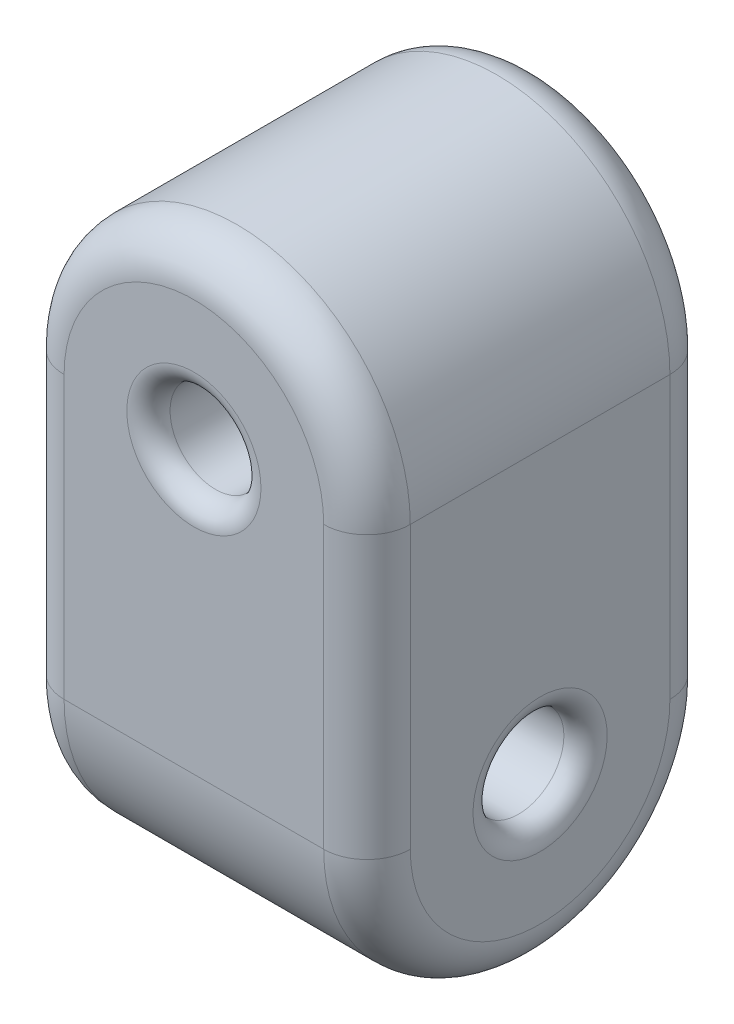
ISO-10303-21;
HEADER;
FILE_DESCRIPTION(('STEP AP214'),'2;1');
FILE_NAME('part.step','',(''),(''),'','','');
FILE_SCHEMA(('AUTOMOTIVE_DESIGN { 1 0 10303 214 1 1 1 1 }'));
ENDSEC;
DATA;
#1=APPLICATION_CONTEXT('core data for automotive mechanical design processes');
#2=APPLICATION_PROTOCOL_DEFINITION('international standard','automotive_design',2000,#1);
#3=PRODUCT_CONTEXT('',#1,'mechanical');
#4=PRODUCT('Part','Part','',(#3));
#5=PRODUCT_RELATED_PRODUCT_CATEGORY('part','',(#4));
#6=PRODUCT_DEFINITION_FORMATION('','',#4);
#7=PRODUCT_DEFINITION_CONTEXT('part definition',#1,'design');
#8=PRODUCT_DEFINITION('design','',#6,#7);
#9=PRODUCT_DEFINITION_SHAPE('','',#8);
#10=(LENGTH_UNIT() NAMED_UNIT(*) SI_UNIT(.MILLI.,.METRE.));
#11=(NAMED_UNIT(*) PLANE_ANGLE_UNIT() SI_UNIT($,.RADIAN.));
#12=(NAMED_UNIT(*) SI_UNIT($,.STERADIAN.) SOLID_ANGLE_UNIT());
#13=UNCERTAINTY_MEASURE_WITH_UNIT(LENGTH_MEASURE(1.E-05),#10,'distance_accuracy_value','');
#14=(GEOMETRIC_REPRESENTATION_CONTEXT(3) GLOBAL_UNCERTAINTY_ASSIGNED_CONTEXT((#13)) GLOBAL_UNIT_ASSIGNED_CONTEXT((#10,
#11,#12)) REPRESENTATION_CONTEXT('',''));
#15=CARTESIAN_POINT('',(0.,0.,0.));
#16=DIRECTION('',(0.,0.,1.));
#17=DIRECTION('',(1.,0.,0.));
#18=AXIS2_PLACEMENT_3D('',#15,#16,#17);
#19=CARTESIAN_POINT('',(0.,0.,8.8));
#20=DIRECTION('',(0.,0.,-1.));
#21=DIRECTION('',(-1.,0.,0.));
#22=AXIS2_PLACEMENT_3D('',#19,#20,#21);
#23=CYLINDRICAL_SURFACE('',#22,4.);
#24=DIRECTION('',(0.,0.,-1.));
#25=VECTOR('',#24,1.);
#26=CARTESIAN_POINT('',(-4.,0.,8.8));
#27=LINE('',#26,#25);
#28=CARTESIAN_POINT('',(-4.,0.,7.8));
#29=VERTEX_POINT('',#28);
#30=CARTESIAN_POINT('',(-4.,0.,1.8));
#31=VERTEX_POINT('',#30);
#32=EDGE_CURVE('E146',#29,#31,#27,.T.);
#33=ORIENTED_EDGE('',*,*,#32,.F.);
#34=CARTESIAN_POINT('',(0.,0.,7.8));
#35=DIRECTION('',(0.,0.,1.));
#36=DIRECTION('',(1.,0.,0.));
#37=AXIS2_PLACEMENT_3D('',#34,#35,#36);
#38=CIRCLE('',#37,4.);
#39=CARTESIAN_POINT('',(4.,0.,7.8));
#40=VERTEX_POINT('',#39);
#41=EDGE_CURVE('E166',#29,#40,#38,.F.);
#42=ORIENTED_EDGE('',*,*,#41,.T.);
#43=DIRECTION('',(0.,0.,-1.));
#44=VECTOR('',#43,1.);
#45=CARTESIAN_POINT('',(4.,0.,8.8));
#46=LINE('',#45,#44);
#47=CARTESIAN_POINT('',(4.,0.,1.8));
#48=VERTEX_POINT('',#47);
#49=EDGE_CURVE('E138',#40,#48,#46,.T.);
#50=ORIENTED_EDGE('',*,*,#49,.T.);
#51=CARTESIAN_POINT('',(0.,0.,1.8));
#52=DIRECTION('',(0.,0.,1.));
#53=DIRECTION('',(1.,0.,0.));
#54=AXIS2_PLACEMENT_3D('',#51,#52,#53);
#55=CIRCLE('',#54,4.);
#56=EDGE_CURVE('E164',#48,#31,#55,.T.);
#57=ORIENTED_EDGE('',*,*,#56,.T.);
#58=EDGE_LOOP('',(#33,#42,#50,#57));
#59=FACE_BOUND('',#58,.T.);
#60=ADVANCED_FACE('F34',(#59),#23,.T.);
#61=CARTESIAN_POINT('',(0.,0.,8.8));
#62=DIRECTION('',(0.,0.,1.));
#63=DIRECTION('',(1.,0.,0.));
#64=AXIS2_PLACEMENT_3D('',#61,#62,#63);
#65=PLANE('',#64);
#66=CARTESIAN_POINT('',(0.,0.,8.8));
#67=DIRECTION('',(0.,0.,1.));
#68=DIRECTION('',(1.,0.,0.));
#69=AXIS2_PLACEMENT_3D('',#66,#67,#68);
#70=CIRCLE('',#69,1.55);
#71=CARTESIAN_POINT('',(1.55,0.,8.8));
#72=VERTEX_POINT('',#71);
#73=EDGE_CURVE('E193',#72,#72,#70,.F.);
#74=ORIENTED_EDGE('',*,*,#73,.T.);
#75=EDGE_LOOP('',(#74));
#76=FACE_BOUND('',#75,.T.);
#77=DIRECTION('',(-1.,0.,0.));
#78=VECTOR('',#77,1.);
#79=CARTESIAN_POINT('',(4.,-6.5,8.8));
#80=LINE('',#79,#78);
#81=CARTESIAN_POINT('',(3.,-6.5,8.8));
#82=VERTEX_POINT('',#81);
#83=CARTESIAN_POINT('',(-2.99999999999999,-6.5,8.8));
#84=VERTEX_POINT('',#83);
#85=EDGE_CURVE('E135',#82,#84,#80,.T.);
#86=ORIENTED_EDGE('',*,*,#85,.F.);
#87=DIRECTION('',(0.,-1.,0.));
#88=VECTOR('',#87,1.);
#89=CARTESIAN_POINT('',(3.,0.,8.8));
#90=LINE('',#89,#88);
#91=CARTESIAN_POINT('',(3.,0.,8.8));
#92=VERTEX_POINT('',#91);
#93=EDGE_CURVE('E158',#82,#92,#90,.F.);
#94=ORIENTED_EDGE('',*,*,#93,.T.);
#95=CARTESIAN_POINT('',(0.,0.,8.8));
#96=DIRECTION('',(0.,0.,1.));
#97=DIRECTION('',(1.,0.,0.));
#98=AXIS2_PLACEMENT_3D('',#95,#96,#97);
#99=CIRCLE('',#98,3.);
#100=CARTESIAN_POINT('',(-3.,0.,8.8));
#101=VERTEX_POINT('',#100);
#102=EDGE_CURVE('E119',#92,#101,#99,.T.);
#103=ORIENTED_EDGE('',*,*,#102,.T.);
#104=DIRECTION('',(0.,-1.,0.));
#105=VECTOR('',#104,1.);
#106=CARTESIAN_POINT('',(-2.99999999999999,-6.5,8.8));
#107=LINE('',#106,#105);
#108=EDGE_CURVE('E156',#101,#84,#107,.T.);
#109=ORIENTED_EDGE('',*,*,#108,.T.);
#110=EDGE_LOOP('',(#86,#94,#103,#109));
#111=FACE_BOUND('',#110,.T.);
#112=ADVANCED_FACE('F210',(#76,#111),#65,.T.);
#113=CARTESIAN_POINT('',(0.,0.,0.8));
#114=DIRECTION('',(0.,0.,1.));
#115=DIRECTION('',(1.,0.,0.));
#116=AXIS2_PLACEMENT_3D('',#113,#114,#115);
#117=PLANE('',#116);
#118=CARTESIAN_POINT('',(0.,0.,0.8));
#119=DIRECTION('',(0.,0.,1.));
#120=DIRECTION('',(1.,0.,0.));
#121=AXIS2_PLACEMENT_3D('',#118,#119,#120);
#122=CIRCLE('',#121,1.55);
#123=CARTESIAN_POINT('',(1.55,0.,0.8));
#124=VERTEX_POINT('',#123);
#125=EDGE_CURVE('E11',#124,#124,#122,.T.);
#126=ORIENTED_EDGE('',*,*,#125,.T.);
#127=EDGE_LOOP('',(#126));
#128=FACE_BOUND('',#127,.T.);
#129=CARTESIAN_POINT('',(0.,0.,0.8));
#130=DIRECTION('',(0.,0.,1.));
#131=DIRECTION('',(1.,0.,0.));
#132=AXIS2_PLACEMENT_3D('',#129,#130,#131);
#133=CIRCLE('',#132,3.);
#134=CARTESIAN_POINT('',(-3.,0.,0.8));
#135=VERTEX_POINT('',#134);
#136=CARTESIAN_POINT('',(3.,0.,0.8));
#137=VERTEX_POINT('',#136);
#138=EDGE_CURVE('E128',#135,#137,#133,.F.);
#139=ORIENTED_EDGE('',*,*,#138,.T.);
#140=DIRECTION('',(0.,-1.,0.));
#141=VECTOR('',#140,1.);
#142=CARTESIAN_POINT('',(3.,-6.5,0.8));
#143=LINE('',#142,#141);
#144=CARTESIAN_POINT('',(3.,-6.5,0.8));
#145=VERTEX_POINT('',#144);
#146=EDGE_CURVE('E103',#137,#145,#143,.T.);
#147=ORIENTED_EDGE('',*,*,#146,.T.);
#148=DIRECTION('',(-1.,0.,0.));
#149=VECTOR('',#148,1.);
#150=CARTESIAN_POINT('',(4.,-6.5,0.8));
#151=LINE('',#150,#149);
#152=CARTESIAN_POINT('',(-2.99999999999999,-6.5,0.8));
#153=VERTEX_POINT('',#152);
#154=EDGE_CURVE('E125',#145,#153,#151,.T.);
#155=ORIENTED_EDGE('',*,*,#154,.T.);
#156=DIRECTION('',(0.,-1.,0.));
#157=VECTOR('',#156,1.);
#158=CARTESIAN_POINT('',(-3.,0.,0.8));
#159=LINE('',#158,#157);
#160=EDGE_CURVE('E131',#153,#135,#159,.F.);
#161=ORIENTED_EDGE('',*,*,#160,.T.);
#162=EDGE_LOOP('',(#139,#147,#155,#161));
#163=FACE_BOUND('',#162,.T.);
#164=ADVANCED_FACE('F124',(#128,#163),#117,.F.);
#165=CARTESIAN_POINT('',(-4.,0.,8.8));
#166=DIRECTION('',(1.,0.,0.));
#167=DIRECTION('',(0.,1.,0.));
#168=AXIS2_PLACEMENT_3D('',#165,#166,#167);
#169=PLANE('',#168);
#170=CARTESIAN_POINT('',(-3.99999999999999,-6.5,4.8));
#171=DIRECTION('',(1.,0.,0.));
#172=DIRECTION('',(0.,1.,0.));
#173=AXIS2_PLACEMENT_3D('',#170,#171,#172);
#174=CIRCLE('',#173,1.55);
#175=CARTESIAN_POINT('',(-4.,-4.95,4.8));
#176=VERTEX_POINT('',#175);
#177=EDGE_CURVE('E167',#176,#176,#174,.T.);
#178=ORIENTED_EDGE('',*,*,#177,.T.);
#179=EDGE_LOOP('',(#178));
#180=FACE_BOUND('',#179,.T.);
#181=CARTESIAN_POINT('',(-3.99999999999999,-6.5,4.8));
#182=DIRECTION('',(1.,0.,0.));
#183=DIRECTION('',(0.,1.,0.));
#184=AXIS2_PLACEMENT_3D('',#181,#182,#183);
#185=CIRCLE('',#184,3.);
#186=CARTESIAN_POINT('',(-3.99999999999999,-6.5,1.8));
#187=VERTEX_POINT('',#186);
#188=CARTESIAN_POINT('',(-3.99999999999999,-6.5,7.8));
#189=VERTEX_POINT('',#188);
#190=EDGE_CURVE('E49',#187,#189,#185,.F.);
#191=ORIENTED_EDGE('',*,*,#190,.T.);
#192=DIRECTION('',(0.,-1.,0.));
#193=VECTOR('',#192,1.);
#194=CARTESIAN_POINT('',(-4.,0.,7.8));
#195=LINE('',#194,#193);
#196=EDGE_CURVE('E162',#189,#29,#195,.F.);
#197=ORIENTED_EDGE('',*,*,#196,.T.);
#198=ORIENTED_EDGE('',*,*,#32,.T.);
#199=DIRECTION('',(0.,-1.,0.));
#200=VECTOR('',#199,1.);
#201=CARTESIAN_POINT('',(-4.,0.,1.8));
#202=LINE('',#201,#200);
#203=EDGE_CURVE('E54',#31,#187,#202,.T.);
#204=ORIENTED_EDGE('',*,*,#203,.T.);
#205=EDGE_LOOP('',(#191,#197,#198,#204));
#206=FACE_BOUND('',#205,.T.);
#207=ADVANCED_FACE('F242',(#180,#206),#169,.F.);
#208=CARTESIAN_POINT('',(4.,0.,8.8));
#209=DIRECTION('',(1.,0.,0.));
#210=DIRECTION('',(0.,1.,0.));
#211=AXIS2_PLACEMENT_3D('',#208,#209,#210);
#212=PLANE('',#211);
#213=CARTESIAN_POINT('',(4.,-6.5,4.8));
#214=DIRECTION('',(1.,0.,0.));
#215=DIRECTION('',(0.,1.,0.));
#216=AXIS2_PLACEMENT_3D('',#213,#214,#215);
#217=CIRCLE('',#216,1.55);
#218=CARTESIAN_POINT('',(4.,-4.95,4.8));
#219=VERTEX_POINT('',#218);
#220=EDGE_CURVE('E190',#219,#219,#217,.F.);
#221=ORIENTED_EDGE('',*,*,#220,.T.);
#222=EDGE_LOOP('',(#221));
#223=FACE_BOUND('',#222,.T.);
#224=CARTESIAN_POINT('',(4.,-6.5,4.8));
#225=DIRECTION('',(1.,0.,0.));
#226=DIRECTION('',(0.,1.,0.));
#227=AXIS2_PLACEMENT_3D('',#224,#225,#226);
#228=CIRCLE('',#227,3.);
#229=CARTESIAN_POINT('',(4.,-6.5,7.8));
#230=VERTEX_POINT('',#229);
#231=CARTESIAN_POINT('',(4.,-6.5,1.8));
#232=VERTEX_POINT('',#231);
#233=EDGE_CURVE('E151',#230,#232,#228,.T.);
#234=ORIENTED_EDGE('',*,*,#233,.T.);
#235=DIRECTION('',(0.,-1.,0.));
#236=VECTOR('',#235,1.);
#237=CARTESIAN_POINT('',(4.,0.,1.8));
#238=LINE('',#237,#236);
#239=EDGE_CURVE('E105',#232,#48,#238,.F.);
#240=ORIENTED_EDGE('',*,*,#239,.T.);
#241=ORIENTED_EDGE('',*,*,#49,.F.);
#242=DIRECTION('',(0.,-1.,0.));
#243=VECTOR('',#242,1.);
#244=CARTESIAN_POINT('',(4.,0.,7.8));
#245=LINE('',#244,#243);
#246=EDGE_CURVE('E130',#40,#230,#245,.T.);
#247=ORIENTED_EDGE('',*,*,#246,.T.);
#248=EDGE_LOOP('',(#234,#240,#241,#247));
#249=FACE_BOUND('',#248,.T.);
#250=ADVANCED_FACE('F241',(#223,#249),#212,.T.);
#251=CARTESIAN_POINT('',(-4.,-6.5,4.8));
#252=DIRECTION('',(1.,0.,0.));
#253=DIRECTION('',(0.,0.,-1.));
#254=AXIS2_PLACEMENT_3D('',#251,#252,#253);
#255=CYLINDRICAL_SURFACE('',#254,4.);
#256=ORIENTED_EDGE('',*,*,#154,.F.);
#257=CARTESIAN_POINT('',(3.,-6.5,4.8));
#258=DIRECTION('',(1.,0.,0.));
#259=DIRECTION('',(0.,1.,0.));
#260=AXIS2_PLACEMENT_3D('',#257,#258,#259);
#261=CIRCLE('',#260,4.);
#262=EDGE_CURVE('E111',#145,#82,#261,.F.);
#263=ORIENTED_EDGE('',*,*,#262,.T.);
#264=ORIENTED_EDGE('',*,*,#85,.T.);
#265=CARTESIAN_POINT('',(-2.99999999999999,-6.5,4.8));
#266=DIRECTION('',(1.,0.,0.));
#267=DIRECTION('',(0.,1.,0.));
#268=AXIS2_PLACEMENT_3D('',#265,#266,#267);
#269=CIRCLE('',#268,4.);
#270=EDGE_CURVE('E120',#84,#153,#269,.T.);
#271=ORIENTED_EDGE('',*,*,#270,.T.);
#272=EDGE_LOOP('',(#256,#263,#264,#271));
#273=FACE_BOUND('',#272,.T.);
#274=ADVANCED_FACE('F133',(#273),#255,.T.);
#275=CARTESIAN_POINT('',(0.,0.,9.6));
#276=DIRECTION('',(0.,0.,-1.));
#277=DIRECTION('',(-1.,0.,0.));
#278=AXIS2_PLACEMENT_3D('',#275,#276,#277);
#279=CYLINDRICAL_SURFACE('',#278,1.05);
#280=CARTESIAN_POINT('',(0.,0.,8.3));
#281=DIRECTION('',(0.,0.,1.));
#282=DIRECTION('',(1.,0.,0.));
#283=AXIS2_PLACEMENT_3D('',#280,#281,#282);
#284=CIRCLE('',#283,1.05);
#285=CARTESIAN_POINT('',(1.05,0.,8.3));
#286=VERTEX_POINT('',#285);
#287=EDGE_CURVE('E42',#286,#286,#284,.T.);
#288=ORIENTED_EDGE('',*,*,#287,.T.);
#289=EDGE_LOOP('',(#288));
#290=FACE_BOUND('',#289,.T.);
#291=CARTESIAN_POINT('',(0.,0.,1.3));
#292=DIRECTION('',(0.,0.,1.));
#293=DIRECTION('',(1.,0.,0.));
#294=AXIS2_PLACEMENT_3D('',#291,#292,#293);
#295=CIRCLE('',#294,1.05);
#296=CARTESIAN_POINT('',(1.05,0.,1.3));
#297=VERTEX_POINT('',#296);
#298=EDGE_CURVE('E196',#297,#297,#295,.F.);
#299=ORIENTED_EDGE('',*,*,#298,.T.);
#300=EDGE_LOOP('',(#299));
#301=FACE_BOUND('',#300,.T.);
#302=ADVANCED_FACE('F201',(#290,#301),#279,.F.);
#303=CARTESIAN_POINT('',(-4.975,-6.5,4.8));
#304=DIRECTION('',(1.,0.,0.));
#305=DIRECTION('',(0.,0.,-1.));
#306=AXIS2_PLACEMENT_3D('',#303,#304,#305);
#307=CYLINDRICAL_SURFACE('',#306,1.05);
#308=CARTESIAN_POINT('',(-3.5,-6.5,4.8));
#309=DIRECTION('',(1.,0.,0.));
#310=DIRECTION('',(0.,1.,0.));
#311=AXIS2_PLACEMENT_3D('',#308,#309,#310);
#312=CIRCLE('',#311,1.05);
#313=CARTESIAN_POINT('',(-3.5,-6.5,3.75));
#314=VERTEX_POINT('',#313);
#315=EDGE_CURVE('E187',#314,#314,#312,.F.);
#316=CARTESIAN_POINT('',(3.5,-6.5,4.8));
#317=DIRECTION('',(1.,0.,0.));
#318=DIRECTION('',(0.,1.,0.));
#319=AXIS2_PLACEMENT_3D('',#316,#317,#318);
#320=CIRCLE('',#319,1.05);
#321=CARTESIAN_POINT('',(3.5,-6.5,3.75));
#322=VERTEX_POINT('',#321);
#323=EDGE_CURVE('E184',#322,#322,#320,.T.);
#324=CARTESIAN_POINT('',(-3.5,-6.5,3.75));
#325=CARTESIAN_POINT('',(-3.42708333333333,-6.5,3.75));
#326=CARTESIAN_POINT('',(-3.35416666666666,-6.5,3.75));
#327=CARTESIAN_POINT('',(-3.20833333333333,-6.5,3.75));
#328=CARTESIAN_POINT('',(-3.13541666666666,-6.5,3.75));
#329=CARTESIAN_POINT('',(-2.98958333333333,-6.5,3.75));
#330=CARTESIAN_POINT('',(-2.91666666666666,-6.5,3.75));
#331=CARTESIAN_POINT('',(-2.77083333333333,-6.5,3.75));
#332=CARTESIAN_POINT('',(-2.69791666666666,-6.5,3.75));
#333=CARTESIAN_POINT('',(-2.55208333333333,-6.5,3.75));
#334=CARTESIAN_POINT('',(-2.47916666666666,-6.5,3.75));
#335=CARTESIAN_POINT('',(-2.33333333333333,-6.5,3.75));
#336=CARTESIAN_POINT('',(-2.26041666666666,-6.5,3.75));
#337=CARTESIAN_POINT('',(-2.11458333333333,-6.5,3.75));
#338=CARTESIAN_POINT('',(-2.04166666666666,-6.5,3.75));
#339=CARTESIAN_POINT('',(-1.89583333333333,-6.5,3.75));
#340=CARTESIAN_POINT('',(-1.82291666666666,-6.5,3.75));
#341=CARTESIAN_POINT('',(-1.67708333333333,-6.5,3.75));
#342=CARTESIAN_POINT('',(-1.60416666666666,-6.5,3.75));
#343=CARTESIAN_POINT('',(-1.45833333333333,-6.5,3.75));
#344=CARTESIAN_POINT('',(-1.38541666666666,-6.5,3.75));
#345=CARTESIAN_POINT('',(-1.23958333333333,-6.5,3.75));
#346=CARTESIAN_POINT('',(-1.16666666666666,-6.5,3.75));
#347=CARTESIAN_POINT('',(-1.02083333333333,-6.5,3.75));
#348=CARTESIAN_POINT('',(-0.947916666666666,-6.5,3.75));
#349=CARTESIAN_POINT('',(-0.802083333333332,-6.5,3.75));
#350=CARTESIAN_POINT('',(-0.729166666666666,-6.5,3.75));
#351=CARTESIAN_POINT('',(-0.583333333333332,-6.5,3.75));
#352=CARTESIAN_POINT('',(-0.510416666666666,-6.5,3.75));
#353=CARTESIAN_POINT('',(-0.364583333333333,-6.5,3.75));
#354=CARTESIAN_POINT('',(-0.291666666666667,-6.5,3.75));
#355=CARTESIAN_POINT('',(-0.145833333333333,-6.5,3.75));
#356=CARTESIAN_POINT('',(-0.0729166666666667,-6.5,3.75));
#357=CARTESIAN_POINT('',(0.0729166666666667,-6.5,3.75));
#358=CARTESIAN_POINT('',(0.145833333333333,-6.5,3.75));
#359=CARTESIAN_POINT('',(0.291666666666667,-6.5,3.75));
#360=CARTESIAN_POINT('',(0.364583333333333,-6.5,3.75));
#361=CARTESIAN_POINT('',(0.510416666666666,-6.5,3.75));
#362=CARTESIAN_POINT('',(0.583333333333332,-6.5,3.75));
#363=CARTESIAN_POINT('',(0.729166666666666,-6.5,3.75));
#364=CARTESIAN_POINT('',(0.802083333333332,-6.5,3.75));
#365=CARTESIAN_POINT('',(0.947916666666666,-6.5,3.75));
#366=CARTESIAN_POINT('',(1.02083333333333,-6.5,3.75));
#367=CARTESIAN_POINT('',(1.16666666666667,-6.5,3.75));
#368=CARTESIAN_POINT('',(1.23958333333333,-6.5,3.75));
#369=CARTESIAN_POINT('',(1.38541666666666,-6.5,3.75));
#370=CARTESIAN_POINT('',(1.45833333333333,-6.5,3.75));
#371=CARTESIAN_POINT('',(1.60416666666666,-6.5,3.75));
#372=CARTESIAN_POINT('',(1.67708333333333,-6.5,3.75));
#373=CARTESIAN_POINT('',(1.82291666666666,-6.5,3.75));
#374=CARTESIAN_POINT('',(1.89583333333333,-6.5,3.75));
#375=CARTESIAN_POINT('',(2.04166666666666,-6.5,3.75));
#376=CARTESIAN_POINT('',(2.11458333333333,-6.5,3.75));
#377=CARTESIAN_POINT('',(2.26041666666666,-6.5,3.75));
#378=CARTESIAN_POINT('',(2.33333333333333,-6.5,3.75));
#379=CARTESIAN_POINT('',(2.47916666666666,-6.5,3.75));
#380=CARTESIAN_POINT('',(2.55208333333333,-6.5,3.75));
#381=CARTESIAN_POINT('',(2.69791666666666,-6.5,3.75));
#382=CARTESIAN_POINT('',(2.77083333333333,-6.5,3.75));
#383=CARTESIAN_POINT('',(2.91666666666666,-6.5,3.75));
#384=CARTESIAN_POINT('',(2.98958333333333,-6.5,3.75));
#385=CARTESIAN_POINT('',(3.13541666666666,-6.5,3.75));
#386=CARTESIAN_POINT('',(3.20833333333333,-6.5,3.75));
#387=CARTESIAN_POINT('',(3.35416666666666,-6.5,3.75));
#388=CARTESIAN_POINT('',(3.42708333333333,-6.5,3.75));
#389=CARTESIAN_POINT('',(3.5,-6.5,3.75));
#390=B_SPLINE_CURVE_WITH_KNOTS('',3,(#324,#325,#326,#327,#328,#329,#330,#331,#332,#333,#334,
#335,#336,#337,#338,#339,#340,#341,#342,#343,#344,#345,#346,#347,#348,#349,#350,#351,#352,#353,
#354,#355,#356,#357,#358,#359,#360,#361,#362,#363,#364,#365,#366,#367,#368,#369,#370,#371,#372,
#373,#374,#375,#376,#377,#378,#379,#380,#381,#382,#383,#384,#385,#386,#387,#388,#389),
.UNSPECIFIED.,.F.,.F.,(4,2,2,2,2,2,2,2,2,2,2,2,2,2,2,2,2,2,2,2,2,2,2,2,2,2,2,2,2,2,2,2,4),(0.,
0.218749999999999,0.4375,0.656249999999999,0.874999999999999,1.09375,1.3125,1.53125,1.75,
1.96875,2.1875,2.40625,2.625,2.84375,3.0625,3.28125,3.5,3.71875,3.93749999999999,
4.15624999999999,4.37499999999999,4.59374999999999,4.81249999999999,5.03124999999999,
5.24999999999999,5.46874999999999,5.68749999999999,5.90624999999999,6.12499999999999,
6.34374999999999,6.56249999999999,6.78124999999999,6.99999999999999),.UNSPECIFIED.);
#391=EDGE_CURVE('BSEAM276',#314,#322,#390,.T.);
#392=ORIENTED_EDGE('',*,*,#315,.T.);
#393=ORIENTED_EDGE('',*,*,#323,.T.);
#394=ORIENTED_EDGE('',*,*,#391,.T.);
#395=ORIENTED_EDGE('',*,*,#391,.F.);
#396=EDGE_LOOP('',(#392,#394,#393,#395));
#397=FACE_BOUND('',#396,.T.);
#398=ADVANCED_FACE('F276',(#397),#307,.F.);
#399=CARTESIAN_POINT('',(-3.,0.,7.8));
#400=DIRECTION('',(0.,1.,0.));
#401=DIRECTION('',(-1.,0.,0.));
#402=AXIS2_PLACEMENT_3D('',#399,#400,#401);
#403=CYLINDRICAL_SURFACE('',#402,1.);
#404=CARTESIAN_POINT('',(-3.,0.,7.8));
#405=DIRECTION('',(0.,1.,0.));
#406=DIRECTION('',(-1.,0.,0.));
#407=AXIS2_PLACEMENT_3D('',#404,#405,#406);
#408=CIRCLE('',#407,1.);
#409=EDGE_CURVE('E141',#29,#101,#408,.T.);
#410=ORIENTED_EDGE('',*,*,#409,.F.);
#411=ORIENTED_EDGE('',*,*,#196,.F.);
#412=CARTESIAN_POINT('',(-2.99999999999999,-6.5,7.8));
#413=DIRECTION('',(0.,-1.,0.));
#414=DIRECTION('',(1.,0.,0.));
#415=AXIS2_PLACEMENT_3D('',#412,#413,#414);
#416=CIRCLE('',#415,1.);
#417=EDGE_CURVE('E136',#84,#189,#416,.T.);
#418=ORIENTED_EDGE('',*,*,#417,.F.);
#419=ORIENTED_EDGE('',*,*,#108,.F.);
#420=EDGE_LOOP('',(#410,#411,#418,#419));
#421=FACE_BOUND('',#420,.T.);
#422=ADVANCED_FACE('F227',(#421),#403,.T.);
#423=CARTESIAN_POINT('',(-2.99999999999999,-6.5,4.8));
#424=DIRECTION('',(1.,0.,0.));
#425=DIRECTION('',(0.,1.,0.));
#426=AXIS2_PLACEMENT_3D('',#423,#424,#425);
#427=TOROIDAL_SURFACE('',#426,3.,1.);
#428=ORIENTED_EDGE('',*,*,#417,.T.);
#429=ORIENTED_EDGE('',*,*,#190,.F.);
#430=CARTESIAN_POINT('',(-2.99999999999999,-6.5,1.8));
#431=DIRECTION('',(0.,1.,0.));
#432=DIRECTION('',(-1.,0.,0.));
#433=AXIS2_PLACEMENT_3D('',#430,#431,#432);
#434=CIRCLE('',#433,1.);
#435=EDGE_CURVE('E177',#153,#187,#434,.T.);
#436=ORIENTED_EDGE('',*,*,#435,.F.);
#437=ORIENTED_EDGE('',*,*,#270,.F.);
#438=EDGE_LOOP('',(#428,#429,#436,#437));
#439=FACE_BOUND('',#438,.T.);
#440=ADVANCED_FACE('F229',(#439),#427,.T.);
#441=CARTESIAN_POINT('',(0.,0.,7.8));
#442=DIRECTION('',(0.,0.,1.));
#443=DIRECTION('',(1.,0.,0.));
#444=AXIS2_PLACEMENT_3D('',#441,#442,#443);
#445=TOROIDAL_SURFACE('',#444,3.,1.);
#446=ORIENTED_EDGE('',*,*,#409,.T.);
#447=ORIENTED_EDGE('',*,*,#102,.F.);
#448=CARTESIAN_POINT('',(3.,0.,7.8));
#449=DIRECTION('',(0.,-1.,0.));
#450=DIRECTION('',(0.,0.,-1.));
#451=AXIS2_PLACEMENT_3D('',#448,#449,#450);
#452=CIRCLE('',#451,1.);
#453=EDGE_CURVE('E174',#40,#92,#452,.T.);
#454=ORIENTED_EDGE('',*,*,#453,.F.);
#455=ORIENTED_EDGE('',*,*,#41,.F.);
#456=EDGE_LOOP('',(#446,#447,#454,#455));
#457=FACE_BOUND('',#456,.T.);
#458=ADVANCED_FACE('F224',(#457),#445,.T.);
#459=CARTESIAN_POINT('',(-3.,0.,1.8));
#460=DIRECTION('',(0.,-1.,0.));
#461=DIRECTION('',(1.,0.,0.));
#462=AXIS2_PLACEMENT_3D('',#459,#460,#461);
#463=CYLINDRICAL_SURFACE('',#462,1.);
#464=ORIENTED_EDGE('',*,*,#435,.T.);
#465=ORIENTED_EDGE('',*,*,#203,.F.);
#466=CARTESIAN_POINT('',(-3.,0.,1.8));
#467=DIRECTION('',(0.,1.,0.));
#468=DIRECTION('',(-1.,0.,0.));
#469=AXIS2_PLACEMENT_3D('',#466,#467,#468);
#470=CIRCLE('',#469,1.);
#471=EDGE_CURVE('E171',#135,#31,#470,.T.);
#472=ORIENTED_EDGE('',*,*,#471,.F.);
#473=ORIENTED_EDGE('',*,*,#160,.F.);
#474=EDGE_LOOP('',(#464,#465,#472,#473));
#475=FACE_BOUND('',#474,.T.);
#476=ADVANCED_FACE('F233',(#475),#463,.T.);
#477=CARTESIAN_POINT('',(3.,0.,7.8));
#478=DIRECTION('',(0.,-1.,0.));
#479=DIRECTION('',(1.,0.,0.));
#480=AXIS2_PLACEMENT_3D('',#477,#478,#479);
#481=CYLINDRICAL_SURFACE('',#480,1.);
#482=ORIENTED_EDGE('',*,*,#453,.T.);
#483=ORIENTED_EDGE('',*,*,#93,.F.);
#484=CARTESIAN_POINT('',(3.,-6.5,7.8));
#485=DIRECTION('',(0.,-1.,0.));
#486=DIRECTION('',(0.,0.,-1.));
#487=AXIS2_PLACEMENT_3D('',#484,#485,#486);
#488=CIRCLE('',#487,1.);
#489=EDGE_CURVE('E114',#230,#82,#488,.T.);
#490=ORIENTED_EDGE('',*,*,#489,.F.);
#491=ORIENTED_EDGE('',*,*,#246,.F.);
#492=EDGE_LOOP('',(#482,#483,#490,#491));
#493=FACE_BOUND('',#492,.T.);
#494=ADVANCED_FACE('F219',(#493),#481,.T.);
#495=CARTESIAN_POINT('',(0.,0.,1.8));
#496=DIRECTION('',(0.,0.,1.));
#497=DIRECTION('',(1.,0.,0.));
#498=AXIS2_PLACEMENT_3D('',#495,#496,#497);
#499=TOROIDAL_SURFACE('',#498,3.,1.);
#500=ORIENTED_EDGE('',*,*,#471,.T.);
#501=ORIENTED_EDGE('',*,*,#56,.F.);
#502=CARTESIAN_POINT('',(3.,0.,1.8));
#503=DIRECTION('',(0.,-1.,0.));
#504=DIRECTION('',(1.,0.,0.));
#505=AXIS2_PLACEMENT_3D('',#502,#503,#504);
#506=CIRCLE('',#505,1.);
#507=EDGE_CURVE('E108',#137,#48,#506,.T.);
#508=ORIENTED_EDGE('',*,*,#507,.F.);
#509=ORIENTED_EDGE('',*,*,#138,.F.);
#510=EDGE_LOOP('',(#500,#501,#508,#509));
#511=FACE_BOUND('',#510,.T.);
#512=ADVANCED_FACE('F236',(#511),#499,.T.);
#513=CARTESIAN_POINT('',(3.,-6.5,4.8));
#514=DIRECTION('',(1.,0.,0.));
#515=DIRECTION('',(0.,1.,0.));
#516=AXIS2_PLACEMENT_3D('',#513,#514,#515);
#517=TOROIDAL_SURFACE('',#516,3.,1.);
#518=ORIENTED_EDGE('',*,*,#489,.T.);
#519=ORIENTED_EDGE('',*,*,#262,.F.);
#520=CARTESIAN_POINT('',(3.,-6.5,1.8));
#521=DIRECTION('',(0.,1.,0.));
#522=DIRECTION('',(0.,0.,1.));
#523=AXIS2_PLACEMENT_3D('',#520,#521,#522);
#524=CIRCLE('',#523,1.);
#525=EDGE_CURVE('E99',#232,#145,#524,.T.);
#526=ORIENTED_EDGE('',*,*,#525,.F.);
#527=ORIENTED_EDGE('',*,*,#233,.F.);
#528=EDGE_LOOP('',(#518,#519,#526,#527));
#529=FACE_BOUND('',#528,.T.);
#530=ADVANCED_FACE('F112',(#529),#517,.T.);
#531=CARTESIAN_POINT('',(3.,0.,1.8));
#532=DIRECTION('',(0.,1.,0.));
#533=DIRECTION('',(-1.,0.,0.));
#534=AXIS2_PLACEMENT_3D('',#531,#532,#533);
#535=CYLINDRICAL_SURFACE('',#534,1.);
#536=ORIENTED_EDGE('',*,*,#507,.T.);
#537=ORIENTED_EDGE('',*,*,#239,.F.);
#538=ORIENTED_EDGE('',*,*,#525,.T.);
#539=ORIENTED_EDGE('',*,*,#146,.F.);
#540=EDGE_LOOP('',(#536,#537,#538,#539));
#541=FACE_BOUND('',#540,.T.);
#542=ADVANCED_FACE('F101',(#541),#535,.T.);
#543=CARTESIAN_POINT('',(-3.49999999999999,-6.5,4.8));
#544=DIRECTION('',(1.,0.,0.));
#545=DIRECTION('',(0.,1.,0.));
#546=AXIS2_PLACEMENT_3D('',#543,#544,#545);
#547=TOROIDAL_SURFACE('',#546,1.55,0.5);
#548=ORIENTED_EDGE('',*,*,#315,.F.);
#549=EDGE_LOOP('',(#548));
#550=FACE_BOUND('',#549,.T.);
#551=ORIENTED_EDGE('',*,*,#177,.F.);
#552=EDGE_LOOP('',(#551));
#553=FACE_BOUND('',#552,.T.);
#554=ADVANCED_FACE('F261',(#550,#553),#547,.T.);
#555=CARTESIAN_POINT('',(3.5,-6.5,4.8));
#556=DIRECTION('',(1.,0.,0.));
#557=DIRECTION('',(0.,1.,0.));
#558=AXIS2_PLACEMENT_3D('',#555,#556,#557);
#559=TOROIDAL_SURFACE('',#558,1.55,0.5);
#560=ORIENTED_EDGE('',*,*,#220,.F.);
#561=EDGE_LOOP('',(#560));
#562=FACE_BOUND('',#561,.T.);
#563=ORIENTED_EDGE('',*,*,#323,.F.);
#564=EDGE_LOOP('',(#563));
#565=FACE_BOUND('',#564,.T.);
#566=ADVANCED_FACE('F207',(#562,#565),#559,.T.);
#567=CARTESIAN_POINT('',(0.,0.,8.3));
#568=DIRECTION('',(0.,0.,1.));
#569=DIRECTION('',(1.,0.,0.));
#570=AXIS2_PLACEMENT_3D('',#567,#568,#569);
#571=TOROIDAL_SURFACE('',#570,1.55,0.5);
#572=ORIENTED_EDGE('',*,*,#287,.F.);
#573=EDGE_LOOP('',(#572));
#574=FACE_BOUND('',#573,.T.);
#575=ORIENTED_EDGE('',*,*,#73,.F.);
#576=EDGE_LOOP('',(#575));
#577=FACE_BOUND('',#576,.T.);
#578=ADVANCED_FACE('F204',(#574,#577),#571,.T.);
#579=CARTESIAN_POINT('',(0.,0.,1.3));
#580=DIRECTION('',(0.,0.,1.));
#581=DIRECTION('',(1.,0.,0.));
#582=AXIS2_PLACEMENT_3D('',#579,#580,#581);
#583=TOROIDAL_SURFACE('',#582,1.55,0.5);
#584=ORIENTED_EDGE('',*,*,#125,.F.);
#585=EDGE_LOOP('',(#584));
#586=FACE_BOUND('',#585,.T.);
#587=ORIENTED_EDGE('',*,*,#298,.F.);
#588=EDGE_LOOP('',(#587));
#589=FACE_BOUND('',#588,.T.);
#590=ADVANCED_FACE('F36',(#586,#589),#583,.T.);
#591=CLOSED_SHELL('',(#60,#112,#164,#207,#250,#274,#302,#398,#422,#440,#458,#476,#494,#512,#530,
#542,#554,#566,#578,#590));
#592=MANIFOLD_SOLID_BREP('B2',#591);
#593=ADVANCED_BREP_SHAPE_REPRESENTATION('',(#18,#592),#14);
#594=SHAPE_DEFINITION_REPRESENTATION(#9,#593);
ENDSEC;
END-ISO-10303-21;
